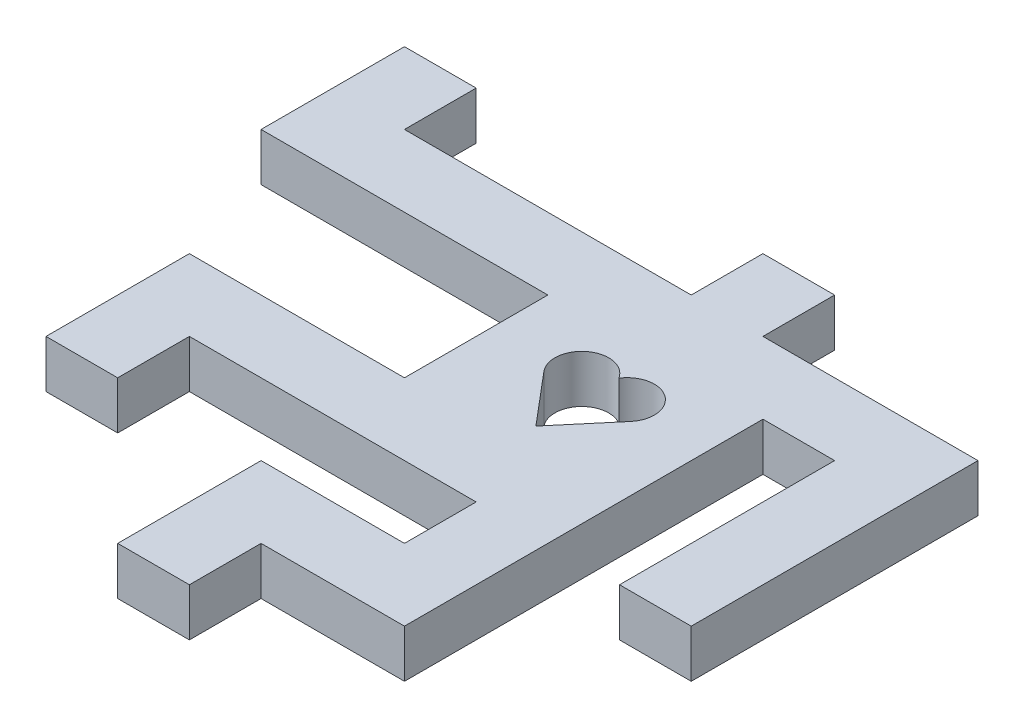
ISO-10303-21;
HEADER;
FILE_DESCRIPTION(('STEP AP214'),'2;1');
FILE_NAME('part.step','',(''),(''),'','','');
FILE_SCHEMA(('AUTOMOTIVE_DESIGN { 1 0 10303 214 1 1 1 1 }'));
ENDSEC;
DATA;
#1=APPLICATION_CONTEXT('core data for automotive mechanical design processes');
#2=APPLICATION_PROTOCOL_DEFINITION('international standard','automotive_design',2000,#1);
#3=PRODUCT_CONTEXT('',#1,'mechanical');
#4=PRODUCT('Part','Part','',(#3));
#5=PRODUCT_RELATED_PRODUCT_CATEGORY('part','',(#4));
#6=PRODUCT_DEFINITION_FORMATION('','',#4);
#7=PRODUCT_DEFINITION_CONTEXT('part definition',#1,'design');
#8=PRODUCT_DEFINITION('design','',#6,#7);
#9=PRODUCT_DEFINITION_SHAPE('','',#8);
#10=(LENGTH_UNIT() NAMED_UNIT(*) SI_UNIT(.MILLI.,.METRE.));
#11=(NAMED_UNIT(*) PLANE_ANGLE_UNIT() SI_UNIT($,.RADIAN.));
#12=(NAMED_UNIT(*) SI_UNIT($,.STERADIAN.) SOLID_ANGLE_UNIT());
#13=UNCERTAINTY_MEASURE_WITH_UNIT(LENGTH_MEASURE(1.E-05),#10,'distance_accuracy_value','');
#14=(GEOMETRIC_REPRESENTATION_CONTEXT(3) GLOBAL_UNCERTAINTY_ASSIGNED_CONTEXT((#13)) GLOBAL_UNIT_ASSIGNED_CONTEXT((#10,
#11,#12)) REPRESENTATION_CONTEXT('',''));
#15=CARTESIAN_POINT('',(0.,0.,0.));
#16=DIRECTION('',(0.,0.,1.));
#17=DIRECTION('',(1.,0.,0.));
#18=AXIS2_PLACEMENT_3D('',#15,#16,#17);
#19=CARTESIAN_POINT('',(-41.25,5.,0.));
#20=DIRECTION('',(1.,0.,0.));
#21=DIRECTION('',(0.,0.,-1.));
#22=AXIS2_PLACEMENT_3D('',#19,#20,#21);
#23=PLANE('',#22);
#24=DIRECTION('',(0.,0.,1.));
#25=VECTOR('',#24,1.);
#26=CARTESIAN_POINT('',(-41.25,0.,0.));
#27=LINE('',#26,#25);
#28=CARTESIAN_POINT('',(-41.25,0.,-22.5));
#29=VERTEX_POINT('',#28);
#30=CARTESIAN_POINT('',(-41.25,0.,-7.5));
#31=VERTEX_POINT('',#30);
#32=EDGE_CURVE('E261',#29,#31,#27,.T.);
#33=ORIENTED_EDGE('',*,*,#32,.T.);
#34=DIRECTION('',(0.,-1.,0.));
#35=VECTOR('',#34,1.);
#36=CARTESIAN_POINT('',(-41.25,5.,-7.5));
#37=LINE('',#36,#35);
#38=CARTESIAN_POINT('',(-41.25,5.,-7.5));
#39=VERTEX_POINT('',#38);
#40=EDGE_CURVE('E462',#39,#31,#37,.T.);
#41=ORIENTED_EDGE('',*,*,#40,.F.);
#42=DIRECTION('',(0.,0.,1.));
#43=VECTOR('',#42,1.);
#44=CARTESIAN_POINT('',(-41.25,5.,0.));
#45=LINE('',#44,#43);
#46=CARTESIAN_POINT('',(-41.25,5.,-22.5));
#47=VERTEX_POINT('',#46);
#48=EDGE_CURVE('E264',#47,#39,#45,.T.);
#49=ORIENTED_EDGE('',*,*,#48,.F.);
#50=DIRECTION('',(0.,-1.,0.));
#51=VECTOR('',#50,1.);
#52=CARTESIAN_POINT('',(-41.25,5.,-22.5));
#53=LINE('',#52,#51);
#54=EDGE_CURVE('E336',#47,#29,#53,.T.);
#55=ORIENTED_EDGE('',*,*,#54,.T.);
#56=EDGE_LOOP('',(#33,#41,#49,#55));
#57=FACE_BOUND('',#56,.T.);
#58=ADVANCED_FACE('F39',(#57),#23,.F.);
#59=CARTESIAN_POINT('',(0.,5.,-7.5));
#60=DIRECTION('',(0.,0.,-1.));
#61=DIRECTION('',(-1.,0.,0.));
#62=AXIS2_PLACEMENT_3D('',#59,#60,#61);
#63=PLANE('',#62);
#64=DIRECTION('',(1.,0.,0.));
#65=VECTOR('',#64,1.);
#66=CARTESIAN_POINT('',(0.,0.,-7.5));
#67=LINE('',#66,#65);
#68=CARTESIAN_POINT('',(-11.25,0.,-7.5));
#69=VERTEX_POINT('',#68);
#70=EDGE_CURVE('E339',#31,#69,#67,.T.);
#71=ORIENTED_EDGE('',*,*,#70,.T.);
#72=DIRECTION('',(0.,-1.,0.));
#73=VECTOR('',#72,1.);
#74=CARTESIAN_POINT('',(-11.25,5.,-7.5));
#75=LINE('',#74,#73);
#76=CARTESIAN_POINT('',(-11.25,5.,-7.5));
#77=VERTEX_POINT('',#76);
#78=EDGE_CURVE('E459',#77,#69,#75,.T.);
#79=ORIENTED_EDGE('',*,*,#78,.F.);
#80=DIRECTION('',(1.,0.,0.));
#81=VECTOR('',#80,1.);
#82=CARTESIAN_POINT('',(0.,5.,-7.5));
#83=LINE('',#82,#81);
#84=EDGE_CURVE('E267',#39,#77,#83,.T.);
#85=ORIENTED_EDGE('',*,*,#84,.F.);
#86=ORIENTED_EDGE('',*,*,#40,.T.);
#87=EDGE_LOOP('',(#71,#79,#85,#86));
#88=FACE_BOUND('',#87,.T.);
#89=ADVANCED_FACE('F486',(#88),#63,.F.);
#90=CARTESIAN_POINT('',(-11.25,5.,0.));
#91=DIRECTION('',(1.,0.,0.));
#92=DIRECTION('',(0.,0.,-1.));
#93=AXIS2_PLACEMENT_3D('',#90,#91,#92);
#94=PLANE('',#93);
#95=DIRECTION('',(0.,0.,1.));
#96=VECTOR('',#95,1.);
#97=CARTESIAN_POINT('',(-11.25,0.,0.));
#98=LINE('',#97,#96);
#99=CARTESIAN_POINT('',(-11.25,0.,7.5));
#100=VERTEX_POINT('',#99);
#101=EDGE_CURVE('E341',#69,#100,#98,.T.);
#102=ORIENTED_EDGE('',*,*,#101,.T.);
#103=DIRECTION('',(0.,-1.,0.));
#104=VECTOR('',#103,1.);
#105=CARTESIAN_POINT('',(-11.25,5.,7.5));
#106=LINE('',#105,#104);
#107=CARTESIAN_POINT('',(-11.25,5.,7.5));
#108=VERTEX_POINT('',#107);
#109=EDGE_CURVE('E457',#108,#100,#106,.T.);
#110=ORIENTED_EDGE('',*,*,#109,.F.);
#111=DIRECTION('',(0.,0.,1.));
#112=VECTOR('',#111,1.);
#113=CARTESIAN_POINT('',(-11.25,5.,0.));
#114=LINE('',#113,#112);
#115=EDGE_CURVE('E270',#77,#108,#114,.T.);
#116=ORIENTED_EDGE('',*,*,#115,.F.);
#117=ORIENTED_EDGE('',*,*,#78,.T.);
#118=EDGE_LOOP('',(#102,#110,#116,#117));
#119=FACE_BOUND('',#118,.T.);
#120=ADVANCED_FACE('F491',(#119),#94,.F.);
#121=CARTESIAN_POINT('',(0.,5.,7.5));
#122=DIRECTION('',(0.,0.,-1.));
#123=DIRECTION('',(-1.,0.,0.));
#124=AXIS2_PLACEMENT_3D('',#121,#122,#123);
#125=PLANE('',#124);
#126=DIRECTION('',(1.,0.,0.));
#127=VECTOR('',#126,1.);
#128=CARTESIAN_POINT('',(0.,0.,7.5));
#129=LINE('',#128,#127);
#130=CARTESIAN_POINT('',(-33.75,0.,7.5));
#131=VERTEX_POINT('',#130);
#132=EDGE_CURVE('E344',#131,#100,#129,.T.);
#133=ORIENTED_EDGE('',*,*,#132,.F.);
#134=DIRECTION('',(0.,-1.,0.));
#135=VECTOR('',#134,1.);
#136=CARTESIAN_POINT('',(-33.75,5.,7.5));
#137=LINE('',#136,#135);
#138=CARTESIAN_POINT('',(-33.75,5.,7.5));
#139=VERTEX_POINT('',#138);
#140=EDGE_CURVE('E455',#139,#131,#137,.T.);
#141=ORIENTED_EDGE('',*,*,#140,.F.);
#142=DIRECTION('',(1.,0.,0.));
#143=VECTOR('',#142,1.);
#144=CARTESIAN_POINT('',(0.,5.,7.5));
#145=LINE('',#144,#143);
#146=EDGE_CURVE('E272',#139,#108,#145,.T.);
#147=ORIENTED_EDGE('',*,*,#146,.T.);
#148=ORIENTED_EDGE('',*,*,#109,.T.);
#149=EDGE_LOOP('',(#133,#141,#147,#148));
#150=FACE_BOUND('',#149,.T.);
#151=ADVANCED_FACE('F593',(#150),#125,.T.);
#152=CARTESIAN_POINT('',(-33.75,5.,0.));
#153=DIRECTION('',(-1.,0.,0.));
#154=DIRECTION('',(0.,0.,1.));
#155=AXIS2_PLACEMENT_3D('',#152,#153,#154);
#156=PLANE('',#155);
#157=DIRECTION('',(0.,0.,-1.));
#158=VECTOR('',#157,1.);
#159=CARTESIAN_POINT('',(-33.75,0.,0.));
#160=LINE('',#159,#158);
#161=CARTESIAN_POINT('',(-33.75,0.,22.5));
#162=VERTEX_POINT('',#161);
#163=EDGE_CURVE('E347',#162,#131,#160,.T.);
#164=ORIENTED_EDGE('',*,*,#163,.F.);
#165=DIRECTION('',(0.,-1.,0.));
#166=VECTOR('',#165,1.);
#167=CARTESIAN_POINT('',(-33.75,5.,22.5));
#168=LINE('',#167,#166);
#169=CARTESIAN_POINT('',(-33.75,5.,22.5));
#170=VERTEX_POINT('',#169);
#171=EDGE_CURVE('E453',#170,#162,#168,.T.);
#172=ORIENTED_EDGE('',*,*,#171,.F.);
#173=DIRECTION('',(0.,0.,-1.));
#174=VECTOR('',#173,1.);
#175=CARTESIAN_POINT('',(-33.75,5.,0.));
#176=LINE('',#175,#174);
#177=EDGE_CURVE('E275',#170,#139,#176,.T.);
#178=ORIENTED_EDGE('',*,*,#177,.T.);
#179=ORIENTED_EDGE('',*,*,#140,.T.);
#180=EDGE_LOOP('',(#164,#172,#178,#179));
#181=FACE_BOUND('',#180,.T.);
#182=ADVANCED_FACE('F589',(#181),#156,.T.);
#183=CARTESIAN_POINT('',(0.,5.,22.5));
#184=DIRECTION('',(0.,0.,1.));
#185=DIRECTION('',(1.,0.,0.));
#186=AXIS2_PLACEMENT_3D('',#183,#184,#185);
#187=PLANE('',#186);
#188=DIRECTION('',(-1.,0.,0.));
#189=VECTOR('',#188,1.);
#190=CARTESIAN_POINT('',(0.,0.,22.5));
#191=LINE('',#190,#189);
#192=CARTESIAN_POINT('',(-26.25,0.,22.5));
#193=VERTEX_POINT('',#192);
#194=EDGE_CURVE('E350',#193,#162,#191,.T.);
#195=ORIENTED_EDGE('',*,*,#194,.F.);
#196=DIRECTION('',(0.,-1.,0.));
#197=VECTOR('',#196,1.);
#198=CARTESIAN_POINT('',(-26.25,5.,22.5));
#199=LINE('',#198,#197);
#200=CARTESIAN_POINT('',(-26.25,5.,22.5));
#201=VERTEX_POINT('',#200);
#202=EDGE_CURVE('E451',#201,#193,#199,.T.);
#203=ORIENTED_EDGE('',*,*,#202,.F.);
#204=DIRECTION('',(-1.,0.,0.));
#205=VECTOR('',#204,1.);
#206=CARTESIAN_POINT('',(0.,5.,22.5));
#207=LINE('',#206,#205);
#208=EDGE_CURVE('E278',#201,#170,#207,.T.);
#209=ORIENTED_EDGE('',*,*,#208,.T.);
#210=ORIENTED_EDGE('',*,*,#171,.T.);
#211=EDGE_LOOP('',(#195,#203,#209,#210));
#212=FACE_BOUND('',#211,.T.);
#213=ADVANCED_FACE('F585',(#212),#187,.T.);
#214=CARTESIAN_POINT('',(-26.25,5.,0.));
#215=DIRECTION('',(1.,0.,0.));
#216=DIRECTION('',(0.,0.,-1.));
#217=AXIS2_PLACEMENT_3D('',#214,#215,#216);
#218=PLANE('',#217);
#219=DIRECTION('',(0.,0.,1.));
#220=VECTOR('',#219,1.);
#221=CARTESIAN_POINT('',(-26.25,0.,0.));
#222=LINE('',#221,#220);
#223=CARTESIAN_POINT('',(-26.25,0.,15.));
#224=VERTEX_POINT('',#223);
#225=EDGE_CURVE('E353',#224,#193,#222,.T.);
#226=ORIENTED_EDGE('',*,*,#225,.F.);
#227=DIRECTION('',(0.,-1.,0.));
#228=VECTOR('',#227,1.);
#229=CARTESIAN_POINT('',(-26.25,5.,15.));
#230=LINE('',#229,#228);
#231=CARTESIAN_POINT('',(-26.25,5.,15.));
#232=VERTEX_POINT('',#231);
#233=EDGE_CURVE('E449',#232,#224,#230,.T.);
#234=ORIENTED_EDGE('',*,*,#233,.F.);
#235=DIRECTION('',(0.,0.,1.));
#236=VECTOR('',#235,1.);
#237=CARTESIAN_POINT('',(-26.25,5.,0.));
#238=LINE('',#237,#236);
#239=EDGE_CURVE('E281',#232,#201,#238,.T.);
#240=ORIENTED_EDGE('',*,*,#239,.T.);
#241=ORIENTED_EDGE('',*,*,#202,.T.);
#242=EDGE_LOOP('',(#226,#234,#240,#241));
#243=FACE_BOUND('',#242,.T.);
#244=ADVANCED_FACE('F581',(#243),#218,.T.);
#245=CARTESIAN_POINT('',(0.,5.,15.));
#246=DIRECTION('',(0.,0.,-1.));
#247=DIRECTION('',(-1.,0.,0.));
#248=AXIS2_PLACEMENT_3D('',#245,#246,#247);
#249=PLANE('',#248);
#250=DIRECTION('',(1.,0.,0.));
#251=VECTOR('',#250,1.);
#252=CARTESIAN_POINT('',(0.,0.,15.));
#253=LINE('',#252,#251);
#254=CARTESIAN_POINT('',(3.75,0.,15.));
#255=VERTEX_POINT('',#254);
#256=EDGE_CURVE('E356',#224,#255,#253,.T.);
#257=ORIENTED_EDGE('',*,*,#256,.T.);
#258=DIRECTION('',(0.,-1.,0.));
#259=VECTOR('',#258,1.);
#260=CARTESIAN_POINT('',(3.75,5.,15.));
#261=LINE('',#260,#259);
#262=CARTESIAN_POINT('',(3.75,5.,15.));
#263=VERTEX_POINT('',#262);
#264=EDGE_CURVE('E447',#263,#255,#261,.T.);
#265=ORIENTED_EDGE('',*,*,#264,.F.);
#266=DIRECTION('',(1.,0.,0.));
#267=VECTOR('',#266,1.);
#268=CARTESIAN_POINT('',(0.,5.,15.));
#269=LINE('',#268,#267);
#270=EDGE_CURVE('E284',#232,#263,#269,.T.);
#271=ORIENTED_EDGE('',*,*,#270,.F.);
#272=ORIENTED_EDGE('',*,*,#233,.T.);
#273=EDGE_LOOP('',(#257,#265,#271,#272));
#274=FACE_BOUND('',#273,.T.);
#275=ADVANCED_FACE('F578',(#274),#249,.F.);
#276=CARTESIAN_POINT('',(3.75,5.,0.));
#277=DIRECTION('',(-1.,0.,0.));
#278=DIRECTION('',(0.,0.,1.));
#279=AXIS2_PLACEMENT_3D('',#276,#277,#278);
#280=PLANE('',#279);
#281=DIRECTION('',(0.,0.,-1.));
#282=VECTOR('',#281,1.);
#283=CARTESIAN_POINT('',(3.75,0.,0.));
#284=LINE('',#283,#282);
#285=CARTESIAN_POINT('',(3.75,0.,22.5));
#286=VERTEX_POINT('',#285);
#287=EDGE_CURVE('E359',#286,#255,#284,.T.);
#288=ORIENTED_EDGE('',*,*,#287,.F.);
#289=DIRECTION('',(0.,-1.,0.));
#290=VECTOR('',#289,1.);
#291=CARTESIAN_POINT('',(3.75,5.,22.5));
#292=LINE('',#291,#290);
#293=CARTESIAN_POINT('',(3.75,5.,22.5));
#294=VERTEX_POINT('',#293);
#295=EDGE_CURVE('E445',#294,#286,#292,.T.);
#296=ORIENTED_EDGE('',*,*,#295,.F.);
#297=DIRECTION('',(0.,0.,-1.));
#298=VECTOR('',#297,1.);
#299=CARTESIAN_POINT('',(3.75,5.,0.));
#300=LINE('',#299,#298);
#301=EDGE_CURVE('E286',#294,#263,#300,.T.);
#302=ORIENTED_EDGE('',*,*,#301,.T.);
#303=ORIENTED_EDGE('',*,*,#264,.T.);
#304=EDGE_LOOP('',(#288,#296,#302,#303));
#305=FACE_BOUND('',#304,.T.);
#306=ADVANCED_FACE('F573',(#305),#280,.T.);
#307=CARTESIAN_POINT('',(0.,5.,22.5));
#308=DIRECTION('',(0.,0.,-1.));
#309=DIRECTION('',(-1.,0.,0.));
#310=AXIS2_PLACEMENT_3D('',#307,#308,#309);
#311=PLANE('',#310);
#312=DIRECTION('',(1.,0.,0.));
#313=VECTOR('',#312,1.);
#314=CARTESIAN_POINT('',(0.,0.,22.5));
#315=LINE('',#314,#313);
#316=CARTESIAN_POINT('',(-11.25,0.,22.5));
#317=VERTEX_POINT('',#316);
#318=EDGE_CURVE('E362',#317,#286,#315,.T.);
#319=ORIENTED_EDGE('',*,*,#318,.F.);
#320=DIRECTION('',(0.,-1.,0.));
#321=VECTOR('',#320,1.);
#322=CARTESIAN_POINT('',(-11.25,5.,22.5));
#323=LINE('',#322,#321);
#324=CARTESIAN_POINT('',(-11.25,5.,22.5));
#325=VERTEX_POINT('',#324);
#326=EDGE_CURVE('E443',#325,#317,#323,.T.);
#327=ORIENTED_EDGE('',*,*,#326,.F.);
#328=DIRECTION('',(1.,0.,0.));
#329=VECTOR('',#328,1.);
#330=CARTESIAN_POINT('',(0.,5.,22.5));
#331=LINE('',#330,#329);
#332=EDGE_CURVE('E289',#325,#294,#331,.T.);
#333=ORIENTED_EDGE('',*,*,#332,.T.);
#334=ORIENTED_EDGE('',*,*,#295,.T.);
#335=EDGE_LOOP('',(#319,#327,#333,#334));
#336=FACE_BOUND('',#335,.T.);
#337=ADVANCED_FACE('F568',(#336),#311,.T.);
#338=CARTESIAN_POINT('',(-11.25,5.,0.));
#339=DIRECTION('',(-1.,0.,0.));
#340=DIRECTION('',(0.,0.,1.));
#341=AXIS2_PLACEMENT_3D('',#338,#339,#340);
#342=PLANE('',#341);
#343=DIRECTION('',(0.,0.,-1.));
#344=VECTOR('',#343,1.);
#345=CARTESIAN_POINT('',(-11.25,0.,0.));
#346=LINE('',#345,#344);
#347=CARTESIAN_POINT('',(-11.25,0.,37.5));
#348=VERTEX_POINT('',#347);
#349=EDGE_CURVE('E365',#348,#317,#346,.T.);
#350=ORIENTED_EDGE('',*,*,#349,.F.);
#351=DIRECTION('',(0.,-1.,0.));
#352=VECTOR('',#351,1.);
#353=CARTESIAN_POINT('',(-11.25,5.,37.5));
#354=LINE('',#353,#352);
#355=CARTESIAN_POINT('',(-11.25,5.,37.5));
#356=VERTEX_POINT('',#355);
#357=EDGE_CURVE('E441',#356,#348,#354,.T.);
#358=ORIENTED_EDGE('',*,*,#357,.F.);
#359=DIRECTION('',(0.,0.,-1.));
#360=VECTOR('',#359,1.);
#361=CARTESIAN_POINT('',(-11.25,5.,0.));
#362=LINE('',#361,#360);
#363=EDGE_CURVE('E292',#356,#325,#362,.T.);
#364=ORIENTED_EDGE('',*,*,#363,.T.);
#365=ORIENTED_EDGE('',*,*,#326,.T.);
#366=EDGE_LOOP('',(#350,#358,#364,#365));
#367=FACE_BOUND('',#366,.T.);
#368=ADVANCED_FACE('F564',(#367),#342,.T.);
#369=CARTESIAN_POINT('',(0.,5.,37.5));
#370=DIRECTION('',(0.,0.,1.));
#371=DIRECTION('',(1.,0.,0.));
#372=AXIS2_PLACEMENT_3D('',#369,#370,#371);
#373=PLANE('',#372);
#374=DIRECTION('',(-1.,0.,0.));
#375=VECTOR('',#374,1.);
#376=CARTESIAN_POINT('',(0.,0.,37.5));
#377=LINE('',#376,#375);
#378=CARTESIAN_POINT('',(-3.75,0.,37.5));
#379=VERTEX_POINT('',#378);
#380=EDGE_CURVE('E368',#379,#348,#377,.T.);
#381=ORIENTED_EDGE('',*,*,#380,.F.);
#382=DIRECTION('',(0.,-1.,0.));
#383=VECTOR('',#382,1.);
#384=CARTESIAN_POINT('',(-3.75,5.,37.5));
#385=LINE('',#384,#383);
#386=CARTESIAN_POINT('',(-3.75,5.,37.5));
#387=VERTEX_POINT('',#386);
#388=EDGE_CURVE('E439',#387,#379,#385,.T.);
#389=ORIENTED_EDGE('',*,*,#388,.F.);
#390=DIRECTION('',(-1.,0.,0.));
#391=VECTOR('',#390,1.);
#392=CARTESIAN_POINT('',(0.,5.,37.5));
#393=LINE('',#392,#391);
#394=EDGE_CURVE('E295',#387,#356,#393,.T.);
#395=ORIENTED_EDGE('',*,*,#394,.T.);
#396=ORIENTED_EDGE('',*,*,#357,.T.);
#397=EDGE_LOOP('',(#381,#389,#395,#396));
#398=FACE_BOUND('',#397,.T.);
#399=ADVANCED_FACE('F560',(#398),#373,.T.);
#400=CARTESIAN_POINT('',(-3.75,5.,0.));
#401=DIRECTION('',(1.,0.,0.));
#402=DIRECTION('',(0.,0.,-1.));
#403=AXIS2_PLACEMENT_3D('',#400,#401,#402);
#404=PLANE('',#403);
#405=DIRECTION('',(0.,0.,1.));
#406=VECTOR('',#405,1.);
#407=CARTESIAN_POINT('',(-3.75,0.,0.));
#408=LINE('',#407,#406);
#409=CARTESIAN_POINT('',(-3.75,0.,30.));
#410=VERTEX_POINT('',#409);
#411=EDGE_CURVE('E371',#410,#379,#408,.T.);
#412=ORIENTED_EDGE('',*,*,#411,.F.);
#413=DIRECTION('',(0.,-1.,0.));
#414=VECTOR('',#413,1.);
#415=CARTESIAN_POINT('',(-3.75,5.,30.));
#416=LINE('',#415,#414);
#417=CARTESIAN_POINT('',(-3.75,5.,30.));
#418=VERTEX_POINT('',#417);
#419=EDGE_CURVE('E437',#418,#410,#416,.T.);
#420=ORIENTED_EDGE('',*,*,#419,.F.);
#421=DIRECTION('',(0.,0.,1.));
#422=VECTOR('',#421,1.);
#423=CARTESIAN_POINT('',(-3.75,5.,0.));
#424=LINE('',#423,#422);
#425=EDGE_CURVE('E298',#418,#387,#424,.T.);
#426=ORIENTED_EDGE('',*,*,#425,.T.);
#427=ORIENTED_EDGE('',*,*,#388,.T.);
#428=EDGE_LOOP('',(#412,#420,#426,#427));
#429=FACE_BOUND('',#428,.T.);
#430=ADVANCED_FACE('F556',(#429),#404,.T.);
#431=CARTESIAN_POINT('',(0.,5.,30.));
#432=DIRECTION('',(0.,0.,1.));
#433=DIRECTION('',(1.,0.,0.));
#434=AXIS2_PLACEMENT_3D('',#431,#432,#433);
#435=PLANE('',#434);
#436=DIRECTION('',(-1.,0.,0.));
#437=VECTOR('',#436,1.);
#438=CARTESIAN_POINT('',(0.,0.,30.));
#439=LINE('',#438,#437);
#440=CARTESIAN_POINT('',(11.25,0.,30.));
#441=VERTEX_POINT('',#440);
#442=EDGE_CURVE('E374',#441,#410,#439,.T.);
#443=ORIENTED_EDGE('',*,*,#442,.F.);
#444=DIRECTION('',(0.,-1.,0.));
#445=VECTOR('',#444,1.);
#446=CARTESIAN_POINT('',(11.25,5.,30.));
#447=LINE('',#446,#445);
#448=CARTESIAN_POINT('',(11.25,5.,30.));
#449=VERTEX_POINT('',#448);
#450=EDGE_CURVE('E435',#449,#441,#447,.T.);
#451=ORIENTED_EDGE('',*,*,#450,.F.);
#452=DIRECTION('',(-1.,0.,0.));
#453=VECTOR('',#452,1.);
#454=CARTESIAN_POINT('',(0.,5.,30.));
#455=LINE('',#454,#453);
#456=EDGE_CURVE('E301',#449,#418,#455,.T.);
#457=ORIENTED_EDGE('',*,*,#456,.T.);
#458=ORIENTED_EDGE('',*,*,#419,.T.);
#459=EDGE_LOOP('',(#443,#451,#457,#458));
#460=FACE_BOUND('',#459,.T.);
#461=ADVANCED_FACE('F552',(#460),#435,.T.);
#462=CARTESIAN_POINT('',(11.25,5.,0.));
#463=DIRECTION('',(1.,0.,0.));
#464=DIRECTION('',(0.,0.,-1.));
#465=AXIS2_PLACEMENT_3D('',#462,#463,#464);
#466=PLANE('',#465);
#467=DIRECTION('',(0.,0.,1.));
#468=VECTOR('',#467,1.);
#469=CARTESIAN_POINT('',(11.25,0.,0.));
#470=LINE('',#469,#468);
#471=CARTESIAN_POINT('',(11.25,0.,-7.5));
#472=VERTEX_POINT('',#471);
#473=EDGE_CURVE('E377',#472,#441,#470,.T.);
#474=ORIENTED_EDGE('',*,*,#473,.F.);
#475=DIRECTION('',(0.,-1.,0.));
#476=VECTOR('',#475,1.);
#477=CARTESIAN_POINT('',(11.25,5.,-7.5));
#478=LINE('',#477,#476);
#479=CARTESIAN_POINT('',(11.25,5.,-7.5));
#480=VERTEX_POINT('',#479);
#481=EDGE_CURVE('E433',#480,#472,#478,.T.);
#482=ORIENTED_EDGE('',*,*,#481,.F.);
#483=DIRECTION('',(0.,0.,1.));
#484=VECTOR('',#483,1.);
#485=CARTESIAN_POINT('',(11.25,5.,0.));
#486=LINE('',#485,#484);
#487=EDGE_CURVE('E304',#480,#449,#486,.T.);
#488=ORIENTED_EDGE('',*,*,#487,.T.);
#489=ORIENTED_EDGE('',*,*,#450,.T.);
#490=EDGE_LOOP('',(#474,#482,#488,#489));
#491=FACE_BOUND('',#490,.T.);
#492=ADVANCED_FACE('F548',(#491),#466,.T.);
#493=CARTESIAN_POINT('',(0.,5.,-7.5));
#494=DIRECTION('',(0.,0.,1.));
#495=DIRECTION('',(1.,0.,0.));
#496=AXIS2_PLACEMENT_3D('',#493,#494,#495);
#497=PLANE('',#496);
#498=DIRECTION('',(-1.,0.,0.));
#499=VECTOR('',#498,1.);
#500=CARTESIAN_POINT('',(0.,0.,-7.5));
#501=LINE('',#500,#499);
#502=CARTESIAN_POINT('',(18.75,0.,-7.5));
#503=VERTEX_POINT('',#502);
#504=EDGE_CURVE('E380',#503,#472,#501,.T.);
#505=ORIENTED_EDGE('',*,*,#504,.F.);
#506=DIRECTION('',(0.,-1.,0.));
#507=VECTOR('',#506,1.);
#508=CARTESIAN_POINT('',(18.75,5.,-7.5));
#509=LINE('',#508,#507);
#510=CARTESIAN_POINT('',(18.75,5.,-7.5));
#511=VERTEX_POINT('',#510);
#512=EDGE_CURVE('E431',#511,#503,#509,.T.);
#513=ORIENTED_EDGE('',*,*,#512,.F.);
#514=DIRECTION('',(-1.,0.,0.));
#515=VECTOR('',#514,1.);
#516=CARTESIAN_POINT('',(0.,5.,-7.5));
#517=LINE('',#516,#515);
#518=EDGE_CURVE('E307',#511,#480,#517,.T.);
#519=ORIENTED_EDGE('',*,*,#518,.T.);
#520=ORIENTED_EDGE('',*,*,#481,.T.);
#521=EDGE_LOOP('',(#505,#513,#519,#520));
#522=FACE_BOUND('',#521,.T.);
#523=ADVANCED_FACE('F544',(#522),#497,.T.);
#524=CARTESIAN_POINT('',(18.75,5.,0.));
#525=DIRECTION('',(-1.,0.,0.));
#526=DIRECTION('',(0.,0.,1.));
#527=AXIS2_PLACEMENT_3D('',#524,#525,#526);
#528=PLANE('',#527);
#529=DIRECTION('',(0.,0.,-1.));
#530=VECTOR('',#529,1.);
#531=CARTESIAN_POINT('',(18.75,0.,0.));
#532=LINE('',#531,#530);
#533=CARTESIAN_POINT('',(18.75,0.,15.));
#534=VERTEX_POINT('',#533);
#535=EDGE_CURVE('E383',#534,#503,#532,.T.);
#536=ORIENTED_EDGE('',*,*,#535,.F.);
#537=DIRECTION('',(0.,-1.,0.));
#538=VECTOR('',#537,1.);
#539=CARTESIAN_POINT('',(18.75,5.,15.));
#540=LINE('',#539,#538);
#541=CARTESIAN_POINT('',(18.75,5.,15.));
#542=VERTEX_POINT('',#541);
#543=EDGE_CURVE('E429',#542,#534,#540,.T.);
#544=ORIENTED_EDGE('',*,*,#543,.F.);
#545=DIRECTION('',(0.,0.,-1.));
#546=VECTOR('',#545,1.);
#547=CARTESIAN_POINT('',(18.75,5.,0.));
#548=LINE('',#547,#546);
#549=EDGE_CURVE('E310',#542,#511,#548,.T.);
#550=ORIENTED_EDGE('',*,*,#549,.T.);
#551=ORIENTED_EDGE('',*,*,#512,.T.);
#552=EDGE_LOOP('',(#536,#544,#550,#551));
#553=FACE_BOUND('',#552,.T.);
#554=ADVANCED_FACE('F540',(#553),#528,.T.);
#555=CARTESIAN_POINT('',(0.,5.,15.));
#556=DIRECTION('',(0.,0.,1.));
#557=DIRECTION('',(1.,0.,0.));
#558=AXIS2_PLACEMENT_3D('',#555,#556,#557);
#559=PLANE('',#558);
#560=DIRECTION('',(-1.,0.,0.));
#561=VECTOR('',#560,1.);
#562=CARTESIAN_POINT('',(0.,0.,15.));
#563=LINE('',#562,#561);
#564=CARTESIAN_POINT('',(26.25,0.,15.));
#565=VERTEX_POINT('',#564);
#566=EDGE_CURVE('E386',#565,#534,#563,.T.);
#567=ORIENTED_EDGE('',*,*,#566,.F.);
#568=DIRECTION('',(0.,-1.,0.));
#569=VECTOR('',#568,1.);
#570=CARTESIAN_POINT('',(26.25,5.,15.));
#571=LINE('',#570,#569);
#572=CARTESIAN_POINT('',(26.25,5.,15.));
#573=VERTEX_POINT('',#572);
#574=EDGE_CURVE('E427',#573,#565,#571,.T.);
#575=ORIENTED_EDGE('',*,*,#574,.F.);
#576=DIRECTION('',(-1.,0.,0.));
#577=VECTOR('',#576,1.);
#578=CARTESIAN_POINT('',(0.,5.,15.));
#579=LINE('',#578,#577);
#580=EDGE_CURVE('E313',#573,#542,#579,.T.);
#581=ORIENTED_EDGE('',*,*,#580,.T.);
#582=ORIENTED_EDGE('',*,*,#543,.T.);
#583=EDGE_LOOP('',(#567,#575,#581,#582));
#584=FACE_BOUND('',#583,.T.);
#585=ADVANCED_FACE('F536',(#584),#559,.T.);
#586=CARTESIAN_POINT('',(26.25,5.,0.));
#587=DIRECTION('',(1.,0.,0.));
#588=DIRECTION('',(0.,0.,-1.));
#589=AXIS2_PLACEMENT_3D('',#586,#587,#588);
#590=PLANE('',#589);
#591=DIRECTION('',(0.,0.,1.));
#592=VECTOR('',#591,1.);
#593=CARTESIAN_POINT('',(26.25,0.,0.));
#594=LINE('',#593,#592);
#595=CARTESIAN_POINT('',(26.25,0.,-15.));
#596=VERTEX_POINT('',#595);
#597=EDGE_CURVE('E389',#596,#565,#594,.T.);
#598=ORIENTED_EDGE('',*,*,#597,.F.);
#599=DIRECTION('',(0.,-1.,0.));
#600=VECTOR('',#599,1.);
#601=CARTESIAN_POINT('',(26.25,5.,-15.));
#602=LINE('',#601,#600);
#603=CARTESIAN_POINT('',(26.25,5.,-15.));
#604=VERTEX_POINT('',#603);
#605=EDGE_CURVE('E425',#604,#596,#602,.T.);
#606=ORIENTED_EDGE('',*,*,#605,.F.);
#607=DIRECTION('',(0.,0.,1.));
#608=VECTOR('',#607,1.);
#609=CARTESIAN_POINT('',(26.25,5.,0.));
#610=LINE('',#609,#608);
#611=EDGE_CURVE('E316',#604,#573,#610,.T.);
#612=ORIENTED_EDGE('',*,*,#611,.T.);
#613=ORIENTED_EDGE('',*,*,#574,.T.);
#614=EDGE_LOOP('',(#598,#606,#612,#613));
#615=FACE_BOUND('',#614,.T.);
#616=ADVANCED_FACE('F532',(#615),#590,.T.);
#617=CARTESIAN_POINT('',(0.,5.,-15.));
#618=DIRECTION('',(0.,0.,-1.));
#619=DIRECTION('',(-1.,0.,0.));
#620=AXIS2_PLACEMENT_3D('',#617,#618,#619);
#621=PLANE('',#620);
#622=DIRECTION('',(1.,0.,0.));
#623=VECTOR('',#622,1.);
#624=CARTESIAN_POINT('',(0.,0.,-15.));
#625=LINE('',#624,#623);
#626=CARTESIAN_POINT('',(3.75,0.,-15.));
#627=VERTEX_POINT('',#626);
#628=EDGE_CURVE('E392',#627,#596,#625,.T.);
#629=ORIENTED_EDGE('',*,*,#628,.F.);
#630=DIRECTION('',(0.,-1.,0.));
#631=VECTOR('',#630,1.);
#632=CARTESIAN_POINT('',(3.75,5.,-15.));
#633=LINE('',#632,#631);
#634=CARTESIAN_POINT('',(3.75,5.,-15.));
#635=VERTEX_POINT('',#634);
#636=EDGE_CURVE('E423',#635,#627,#633,.T.);
#637=ORIENTED_EDGE('',*,*,#636,.F.);
#638=DIRECTION('',(1.,0.,0.));
#639=VECTOR('',#638,1.);
#640=CARTESIAN_POINT('',(0.,5.,-15.));
#641=LINE('',#640,#639);
#642=EDGE_CURVE('E319',#635,#604,#641,.T.);
#643=ORIENTED_EDGE('',*,*,#642,.T.);
#644=ORIENTED_EDGE('',*,*,#605,.T.);
#645=EDGE_LOOP('',(#629,#637,#643,#644));
#646=FACE_BOUND('',#645,.T.);
#647=ADVANCED_FACE('F526',(#646),#621,.T.);
#648=CARTESIAN_POINT('',(3.75,5.,0.));
#649=DIRECTION('',(-1.,0.,0.));
#650=DIRECTION('',(0.,0.,1.));
#651=AXIS2_PLACEMENT_3D('',#648,#649,#650);
#652=PLANE('',#651);
#653=DIRECTION('',(0.,0.,-1.));
#654=VECTOR('',#653,1.);
#655=CARTESIAN_POINT('',(3.75,0.,0.));
#656=LINE('',#655,#654);
#657=CARTESIAN_POINT('',(3.75,0.,-22.5));
#658=VERTEX_POINT('',#657);
#659=EDGE_CURVE('E395',#627,#658,#656,.T.);
#660=ORIENTED_EDGE('',*,*,#659,.T.);
#661=DIRECTION('',(0.,-1.,0.));
#662=VECTOR('',#661,1.);
#663=CARTESIAN_POINT('',(3.75,5.,-22.5));
#664=LINE('',#663,#662);
#665=CARTESIAN_POINT('',(3.75,5.,-22.5));
#666=VERTEX_POINT('',#665);
#667=EDGE_CURVE('E421',#666,#658,#664,.T.);
#668=ORIENTED_EDGE('',*,*,#667,.F.);
#669=DIRECTION('',(0.,0.,-1.));
#670=VECTOR('',#669,1.);
#671=CARTESIAN_POINT('',(3.75,5.,0.));
#672=LINE('',#671,#670);
#673=EDGE_CURVE('E322',#635,#666,#672,.T.);
#674=ORIENTED_EDGE('',*,*,#673,.F.);
#675=ORIENTED_EDGE('',*,*,#636,.T.);
#676=EDGE_LOOP('',(#660,#668,#674,#675));
#677=FACE_BOUND('',#676,.T.);
#678=ADVANCED_FACE('F596',(#677),#652,.F.);
#679=CARTESIAN_POINT('',(0.,5.,-22.5));
#680=DIRECTION('',(0.,0.,-1.));
#681=DIRECTION('',(-1.,0.,0.));
#682=AXIS2_PLACEMENT_3D('',#679,#680,#681);
#683=PLANE('',#682);
#684=DIRECTION('',(1.,0.,0.));
#685=VECTOR('',#684,1.);
#686=CARTESIAN_POINT('',(0.,0.,-22.5));
#687=LINE('',#686,#685);
#688=CARTESIAN_POINT('',(-3.75,0.,-22.5));
#689=VERTEX_POINT('',#688);
#690=EDGE_CURVE('E398',#689,#658,#687,.T.);
#691=ORIENTED_EDGE('',*,*,#690,.F.);
#692=DIRECTION('',(0.,-1.,0.));
#693=VECTOR('',#692,1.);
#694=CARTESIAN_POINT('',(-3.75,5.,-22.5));
#695=LINE('',#694,#693);
#696=CARTESIAN_POINT('',(-3.75,5.,-22.5));
#697=VERTEX_POINT('',#696);
#698=EDGE_CURVE('E419',#697,#689,#695,.T.);
#699=ORIENTED_EDGE('',*,*,#698,.F.);
#700=DIRECTION('',(1.,0.,0.));
#701=VECTOR('',#700,1.);
#702=CARTESIAN_POINT('',(0.,5.,-22.5));
#703=LINE('',#702,#701);
#704=EDGE_CURVE('E324',#697,#666,#703,.T.);
#705=ORIENTED_EDGE('',*,*,#704,.T.);
#706=ORIENTED_EDGE('',*,*,#667,.T.);
#707=EDGE_LOOP('',(#691,#699,#705,#706));
#708=FACE_BOUND('',#707,.T.);
#709=ADVANCED_FACE('F520',(#708),#683,.T.);
#710=CARTESIAN_POINT('',(-3.75,5.,0.));
#711=DIRECTION('',(-1.,0.,0.));
#712=DIRECTION('',(0.,0.,1.));
#713=AXIS2_PLACEMENT_3D('',#710,#711,#712);
#714=PLANE('',#713);
#715=DIRECTION('',(0.,0.,-1.));
#716=VECTOR('',#715,1.);
#717=CARTESIAN_POINT('',(-3.75,0.,0.));
#718=LINE('',#717,#716);
#719=CARTESIAN_POINT('',(-3.75,0.,-15.));
#720=VERTEX_POINT('',#719);
#721=EDGE_CURVE('E401',#720,#689,#718,.T.);
#722=ORIENTED_EDGE('',*,*,#721,.F.);
#723=DIRECTION('',(0.,-1.,0.));
#724=VECTOR('',#723,1.);
#725=CARTESIAN_POINT('',(-3.75,5.,-15.));
#726=LINE('',#725,#724);
#727=CARTESIAN_POINT('',(-3.75,5.,-15.));
#728=VERTEX_POINT('',#727);
#729=EDGE_CURVE('E417',#728,#720,#726,.T.);
#730=ORIENTED_EDGE('',*,*,#729,.F.);
#731=DIRECTION('',(0.,0.,-1.));
#732=VECTOR('',#731,1.);
#733=CARTESIAN_POINT('',(-3.75,5.,0.));
#734=LINE('',#733,#732);
#735=EDGE_CURVE('E327',#728,#697,#734,.T.);
#736=ORIENTED_EDGE('',*,*,#735,.T.);
#737=ORIENTED_EDGE('',*,*,#698,.T.);
#738=EDGE_LOOP('',(#722,#730,#736,#737));
#739=FACE_BOUND('',#738,.T.);
#740=ADVANCED_FACE('F514',(#739),#714,.T.);
#741=CARTESIAN_POINT('',(0.,5.,-15.));
#742=DIRECTION('',(0.,0.,1.));
#743=DIRECTION('',(1.,0.,0.));
#744=AXIS2_PLACEMENT_3D('',#741,#742,#743);
#745=PLANE('',#744);
#746=DIRECTION('',(-1.,0.,0.));
#747=VECTOR('',#746,1.);
#748=CARTESIAN_POINT('',(0.,0.,-15.));
#749=LINE('',#748,#747);
#750=CARTESIAN_POINT('',(-33.75,0.,-15.));
#751=VERTEX_POINT('',#750);
#752=EDGE_CURVE('E404',#720,#751,#749,.T.);
#753=ORIENTED_EDGE('',*,*,#752,.T.);
#754=DIRECTION('',(0.,-1.,0.));
#755=VECTOR('',#754,1.);
#756=CARTESIAN_POINT('',(-33.75,5.,-15.));
#757=LINE('',#756,#755);
#758=CARTESIAN_POINT('',(-33.75,5.,-15.));
#759=VERTEX_POINT('',#758);
#760=EDGE_CURVE('E414',#759,#751,#757,.T.);
#761=ORIENTED_EDGE('',*,*,#760,.F.);
#762=DIRECTION('',(-1.,0.,0.));
#763=VECTOR('',#762,1.);
#764=CARTESIAN_POINT('',(0.,5.,-15.));
#765=LINE('',#764,#763);
#766=EDGE_CURVE('E330',#728,#759,#765,.T.);
#767=ORIENTED_EDGE('',*,*,#766,.F.);
#768=ORIENTED_EDGE('',*,*,#729,.T.);
#769=EDGE_LOOP('',(#753,#761,#767,#768));
#770=FACE_BOUND('',#769,.T.);
#771=ADVANCED_FACE('F732',(#770),#745,.F.);
#772=CARTESIAN_POINT('',(-33.75,5.,0.));
#773=DIRECTION('',(-1.,0.,0.));
#774=DIRECTION('',(0.,0.,1.));
#775=AXIS2_PLACEMENT_3D('',#772,#773,#774);
#776=PLANE('',#775);
#777=DIRECTION('',(0.,0.,-1.));
#778=VECTOR('',#777,1.);
#779=CARTESIAN_POINT('',(-33.75,0.,0.));
#780=LINE('',#779,#778);
#781=CARTESIAN_POINT('',(-33.75,0.,-22.5));
#782=VERTEX_POINT('',#781);
#783=EDGE_CURVE('E406',#751,#782,#780,.T.);
#784=ORIENTED_EDGE('',*,*,#783,.T.);
#785=DIRECTION('',(0.,-1.,0.));
#786=VECTOR('',#785,1.);
#787=CARTESIAN_POINT('',(-33.75,5.,-22.5));
#788=LINE('',#787,#786);
#789=CARTESIAN_POINT('',(-33.75,5.,-22.5));
#790=VERTEX_POINT('',#789);
#791=EDGE_CURVE('E411',#790,#782,#788,.T.);
#792=ORIENTED_EDGE('',*,*,#791,.F.);
#793=DIRECTION('',(0.,0.,-1.));
#794=VECTOR('',#793,1.);
#795=CARTESIAN_POINT('',(-33.75,5.,0.));
#796=LINE('',#795,#794);
#797=EDGE_CURVE('E332',#759,#790,#796,.T.);
#798=ORIENTED_EDGE('',*,*,#797,.F.);
#799=ORIENTED_EDGE('',*,*,#760,.T.);
#800=EDGE_LOOP('',(#784,#792,#798,#799));
#801=FACE_BOUND('',#800,.T.);
#802=ADVANCED_FACE('F508',(#801),#776,.F.);
#803=CARTESIAN_POINT('',(0.,5.,-22.5));
#804=DIRECTION('',(0.,0.,1.));
#805=DIRECTION('',(1.,0.,0.));
#806=AXIS2_PLACEMENT_3D('',#803,#804,#805);
#807=PLANE('',#806);
#808=DIRECTION('',(-1.,0.,0.));
#809=VECTOR('',#808,1.);
#810=CARTESIAN_POINT('',(0.,0.,-22.5));
#811=LINE('',#810,#809);
#812=EDGE_CURVE('E268',#782,#29,#811,.T.);
#813=ORIENTED_EDGE('',*,*,#812,.T.);
#814=ORIENTED_EDGE('',*,*,#54,.F.);
#815=DIRECTION('',(-1.,0.,0.));
#816=VECTOR('',#815,1.);
#817=CARTESIAN_POINT('',(0.,5.,-22.5));
#818=LINE('',#817,#816);
#819=EDGE_CURVE('E334',#790,#47,#818,.T.);
#820=ORIENTED_EDGE('',*,*,#819,.F.);
#821=ORIENTED_EDGE('',*,*,#791,.T.);
#822=EDGE_LOOP('',(#813,#814,#820,#821));
#823=FACE_BOUND('',#822,.T.);
#824=ADVANCED_FACE('F506',(#823),#807,.F.);
#825=CARTESIAN_POINT('',(0.,5.,0.));
#826=DIRECTION('',(0.,1.,0.));
#827=DIRECTION('',(0.,0.,1.));
#828=AXIS2_PLACEMENT_3D('',#825,#826,#827);
#829=PLANE('',#828);
#830=DIRECTION('',(0.645066860701827,0.,0.764126131750701));
#831=VECTOR('',#830,1.);
#832=CARTESIAN_POINT('',(0.,5.,5.));
#833=LINE('',#832,#831);
#834=CARTESIAN_POINT('',(-4.53488069332511,5.,-0.371878565225522));
#835=VERTEX_POINT('',#834);
#836=CARTESIAN_POINT('',(0.,5.,5.));
#837=VERTEX_POINT('',#836);
#838=EDGE_CURVE('E53',#835,#837,#833,.T.);
#839=ORIENTED_EDGE('',*,*,#838,.F.);
#840=CARTESIAN_POINT('',(-2.3851391759998,5.,-2.18666666666666));
#841=DIRECTION('',(0.,1.,0.));
#842=DIRECTION('',(0.,0.,-1.));
#843=AXIS2_PLACEMENT_3D('',#840,#841,#842);
#844=CIRCLE('',#843,2.81333333333334);
#845=CARTESIAN_POINT('',(0.,5.,-3.67863032425199));
#846=VERTEX_POINT('',#845);
#847=EDGE_CURVE('E254',#846,#835,#844,.T.);
#848=ORIENTED_EDGE('',*,*,#847,.F.);
#849=CARTESIAN_POINT('',(2.38513917599981,5.,-2.18666666666666));
#850=DIRECTION('',(0.,1.,0.));
#851=DIRECTION('',(0.,0.,1.));
#852=AXIS2_PLACEMENT_3D('',#849,#850,#851);
#853=CIRCLE('',#852,2.81333333333334);
#854=CARTESIAN_POINT('',(4.53488069332512,5.,-0.371878565225521));
#855=VERTEX_POINT('',#854);
#856=EDGE_CURVE('E238',#855,#846,#853,.T.);
#857=ORIENTED_EDGE('',*,*,#856,.F.);
#858=DIRECTION('',(0.645066860701827,0.,-0.764126131750701));
#859=VECTOR('',#858,1.);
#860=CARTESIAN_POINT('',(0.,5.,5.));
#861=LINE('',#860,#859);
#862=EDGE_CURVE('E247',#837,#855,#861,.T.);
#863=ORIENTED_EDGE('',*,*,#862,.F.);
#864=EDGE_LOOP('',(#839,#848,#857,#863));
#865=FACE_BOUND('',#864,.T.);
#866=ORIENTED_EDGE('',*,*,#48,.T.);
#867=ORIENTED_EDGE('',*,*,#84,.T.);
#868=ORIENTED_EDGE('',*,*,#115,.T.);
#869=ORIENTED_EDGE('',*,*,#146,.F.);
#870=ORIENTED_EDGE('',*,*,#177,.F.);
#871=ORIENTED_EDGE('',*,*,#208,.F.);
#872=ORIENTED_EDGE('',*,*,#239,.F.);
#873=ORIENTED_EDGE('',*,*,#270,.T.);
#874=ORIENTED_EDGE('',*,*,#301,.F.);
#875=ORIENTED_EDGE('',*,*,#332,.F.);
#876=ORIENTED_EDGE('',*,*,#363,.F.);
#877=ORIENTED_EDGE('',*,*,#394,.F.);
#878=ORIENTED_EDGE('',*,*,#425,.F.);
#879=ORIENTED_EDGE('',*,*,#456,.F.);
#880=ORIENTED_EDGE('',*,*,#487,.F.);
#881=ORIENTED_EDGE('',*,*,#518,.F.);
#882=ORIENTED_EDGE('',*,*,#549,.F.);
#883=ORIENTED_EDGE('',*,*,#580,.F.);
#884=ORIENTED_EDGE('',*,*,#611,.F.);
#885=ORIENTED_EDGE('',*,*,#642,.F.);
#886=ORIENTED_EDGE('',*,*,#673,.T.);
#887=ORIENTED_EDGE('',*,*,#704,.F.);
#888=ORIENTED_EDGE('',*,*,#735,.F.);
#889=ORIENTED_EDGE('',*,*,#766,.T.);
#890=ORIENTED_EDGE('',*,*,#797,.T.);
#891=ORIENTED_EDGE('',*,*,#819,.T.);
#892=EDGE_LOOP('',(#866,#867,#868,#869,#870,#871,#872,#873,#874,#875,#876,#877,#878,#879,#880,
#881,#882,#883,#884,#885,#886,#887,#888,#889,#890,#891));
#893=FACE_BOUND('',#892,.T.);
#894=ADVANCED_FACE('F251',(#865,#893),#829,.T.);
#895=CARTESIAN_POINT('',(0.,0.,0.));
#896=DIRECTION('',(0.,1.,0.));
#897=DIRECTION('',(0.,0.,1.));
#898=AXIS2_PLACEMENT_3D('',#895,#896,#897);
#899=PLANE('',#898);
#900=CARTESIAN_POINT('',(-2.3851391759998,0.,-2.18666666666666));
#901=DIRECTION('',(0.,1.,0.));
#902=DIRECTION('',(0.,0.,1.));
#903=AXIS2_PLACEMENT_3D('',#900,#901,#902);
#904=CIRCLE('',#903,2.81333333333334);
#905=CARTESIAN_POINT('',(0.,0.,-3.67863032425199));
#906=VERTEX_POINT('',#905);
#907=CARTESIAN_POINT('',(-4.53488069332511,0.,-0.371878565225522));
#908=VERTEX_POINT('',#907);
#909=EDGE_CURVE('E46',#906,#908,#904,.T.);
#910=ORIENTED_EDGE('',*,*,#909,.T.);
#911=DIRECTION('',(0.645066860701827,0.,0.764126131750701));
#912=VECTOR('',#911,1.);
#913=CARTESIAN_POINT('',(-2.46456222494328,0.,2.08055627387855));
#914=LINE('',#913,#912);
#915=CARTESIAN_POINT('',(0.,0.,5.));
#916=VERTEX_POINT('',#915);
#917=EDGE_CURVE('E11',#908,#916,#914,.T.);
#918=ORIENTED_EDGE('',*,*,#917,.T.);
#919=DIRECTION('',(0.645066860701827,0.,-0.764126131750701));
#920=VECTOR('',#919,1.);
#921=CARTESIAN_POINT('',(2.46456222494328,0.,2.08055627387855));
#922=LINE('',#921,#920);
#923=CARTESIAN_POINT('',(4.53488069332512,0.,-0.37187856522552));
#924=VERTEX_POINT('',#923);
#925=EDGE_CURVE('E465',#916,#924,#922,.T.);
#926=ORIENTED_EDGE('',*,*,#925,.T.);
#927=CARTESIAN_POINT('',(2.38513917599981,0.,-2.18666666666666));
#928=DIRECTION('',(0.,1.,0.));
#929=DIRECTION('',(0.,0.,1.));
#930=AXIS2_PLACEMENT_3D('',#927,#928,#929);
#931=CIRCLE('',#930,2.81333333333334);
#932=EDGE_CURVE('E241',#924,#906,#931,.T.);
#933=ORIENTED_EDGE('',*,*,#932,.T.);
#934=EDGE_LOOP('',(#910,#918,#926,#933));
#935=FACE_BOUND('',#934,.T.);
#936=ORIENTED_EDGE('',*,*,#32,.F.);
#937=ORIENTED_EDGE('',*,*,#812,.F.);
#938=ORIENTED_EDGE('',*,*,#783,.F.);
#939=ORIENTED_EDGE('',*,*,#752,.F.);
#940=ORIENTED_EDGE('',*,*,#721,.T.);
#941=ORIENTED_EDGE('',*,*,#690,.T.);
#942=ORIENTED_EDGE('',*,*,#659,.F.);
#943=ORIENTED_EDGE('',*,*,#628,.T.);
#944=ORIENTED_EDGE('',*,*,#597,.T.);
#945=ORIENTED_EDGE('',*,*,#566,.T.);
#946=ORIENTED_EDGE('',*,*,#535,.T.);
#947=ORIENTED_EDGE('',*,*,#504,.T.);
#948=ORIENTED_EDGE('',*,*,#473,.T.);
#949=ORIENTED_EDGE('',*,*,#442,.T.);
#950=ORIENTED_EDGE('',*,*,#411,.T.);
#951=ORIENTED_EDGE('',*,*,#380,.T.);
#952=ORIENTED_EDGE('',*,*,#349,.T.);
#953=ORIENTED_EDGE('',*,*,#318,.T.);
#954=ORIENTED_EDGE('',*,*,#287,.T.);
#955=ORIENTED_EDGE('',*,*,#256,.F.);
#956=ORIENTED_EDGE('',*,*,#225,.T.);
#957=ORIENTED_EDGE('',*,*,#194,.T.);
#958=ORIENTED_EDGE('',*,*,#163,.T.);
#959=ORIENTED_EDGE('',*,*,#132,.T.);
#960=ORIENTED_EDGE('',*,*,#101,.F.);
#961=ORIENTED_EDGE('',*,*,#70,.F.);
#962=EDGE_LOOP('',(#936,#937,#938,#939,#940,#941,#942,#943,#944,#945,#946,#947,#948,#949,#950,
#951,#952,#953,#954,#955,#956,#957,#958,#959,#960,#961));
#963=FACE_BOUND('',#962,.T.);
#964=ADVANCED_FACE('F469',(#935,#963),#899,.F.);
#965=CARTESIAN_POINT('',(0.,-5.,5.));
#966=DIRECTION('',(-0.764126131750701,0.,0.645066860701827));
#967=DIRECTION('',(0.645066860701827,0.,0.764126131750701));
#968=AXIS2_PLACEMENT_3D('',#965,#966,#967);
#969=PLANE('',#968);
#970=DIRECTION('',(0.,1.,0.));
#971=VECTOR('',#970,1.);
#972=CARTESIAN_POINT('',(-4.53488069332511,-5.,-0.371878565225522));
#973=LINE('',#972,#971);
#974=EDGE_CURVE('E259',#908,#835,#973,.T.);
#975=ORIENTED_EDGE('',*,*,#974,.T.);
#976=ORIENTED_EDGE('',*,*,#838,.T.);
#977=DIRECTION('',(0.,1.,0.));
#978=VECTOR('',#977,1.);
#979=CARTESIAN_POINT('',(0.,-5.,5.));
#980=LINE('',#979,#978);
#981=EDGE_CURVE('E244',#916,#837,#980,.T.);
#982=ORIENTED_EDGE('',*,*,#981,.F.);
#983=ORIENTED_EDGE('',*,*,#917,.F.);
#984=EDGE_LOOP('',(#975,#976,#982,#983));
#985=FACE_BOUND('',#984,.T.);
#986=ADVANCED_FACE('F474',(#985),#969,.F.);
#987=CARTESIAN_POINT('',(-2.3851391759998,-5.,-2.18666666666666));
#988=DIRECTION('',(0.,1.,0.));
#989=DIRECTION('',(0.,0.,1.));
#990=AXIS2_PLACEMENT_3D('',#987,#988,#989);
#991=CYLINDRICAL_SURFACE('',#990,2.81333333333334);
#992=DIRECTION('',(0.,1.,0.));
#993=VECTOR('',#992,1.);
#994=CARTESIAN_POINT('',(0.,-5.,-3.67863032425199));
#995=LINE('',#994,#993);
#996=EDGE_CURVE('E243',#906,#846,#995,.T.);
#997=ORIENTED_EDGE('',*,*,#996,.T.);
#998=ORIENTED_EDGE('',*,*,#847,.T.);
#999=ORIENTED_EDGE('',*,*,#974,.F.);
#1000=ORIENTED_EDGE('',*,*,#909,.F.);
#1001=EDGE_LOOP('',(#997,#998,#999,#1000));
#1002=FACE_BOUND('',#1001,.T.);
#1003=ADVANCED_FACE('F473',(#1002),#991,.F.);
#1004=CARTESIAN_POINT('',(2.38513917599981,-5.,-2.18666666666666));
#1005=DIRECTION('',(0.,1.,0.));
#1006=DIRECTION('',(0.,0.,1.));
#1007=AXIS2_PLACEMENT_3D('',#1004,#1005,#1006);
#1008=CYLINDRICAL_SURFACE('',#1007,2.81333333333334);
#1009=DIRECTION('',(0.,1.,0.));
#1010=VECTOR('',#1009,1.);
#1011=CARTESIAN_POINT('',(4.53488069332512,-5.,-0.371878565225521));
#1012=LINE('',#1011,#1010);
#1013=EDGE_CURVE('E61',#924,#855,#1012,.T.);
#1014=ORIENTED_EDGE('',*,*,#1013,.T.);
#1015=ORIENTED_EDGE('',*,*,#856,.T.);
#1016=ORIENTED_EDGE('',*,*,#996,.F.);
#1017=ORIENTED_EDGE('',*,*,#932,.F.);
#1018=EDGE_LOOP('',(#1014,#1015,#1016,#1017));
#1019=FACE_BOUND('',#1018,.T.);
#1020=ADVANCED_FACE('F235',(#1019),#1008,.F.);
#1021=CARTESIAN_POINT('',(0.,-5.,5.));
#1022=DIRECTION('',(0.764126131750701,0.,0.645066860701827));
#1023=DIRECTION('',(0.645066860701827,0.,-0.764126131750701));
#1024=AXIS2_PLACEMENT_3D('',#1021,#1022,#1023);
#1025=PLANE('',#1024);
#1026=ORIENTED_EDGE('',*,*,#981,.T.);
#1027=ORIENTED_EDGE('',*,*,#862,.T.);
#1028=ORIENTED_EDGE('',*,*,#1013,.F.);
#1029=ORIENTED_EDGE('',*,*,#925,.F.);
#1030=EDGE_LOOP('',(#1026,#1027,#1028,#1029));
#1031=FACE_BOUND('',#1030,.T.);
#1032=ADVANCED_FACE('F248',(#1031),#1025,.F.);
#1033=CLOSED_SHELL('',(#58,#89,#120,#151,#182,#213,#244,#275,#306,#337,#368,#399,#430,#461,#492,
#523,#554,#585,#616,#647,#678,#709,#740,#771,#802,#824,#894,#964,#986,#1003,#1020,#1032));
#1034=MANIFOLD_SOLID_BREP('B2',#1033);
#1035=ADVANCED_BREP_SHAPE_REPRESENTATION('',(#18,#1034),#14);
#1036=SHAPE_DEFINITION_REPRESENTATION(#9,#1035);
ENDSEC;
END-ISO-10303-21;
